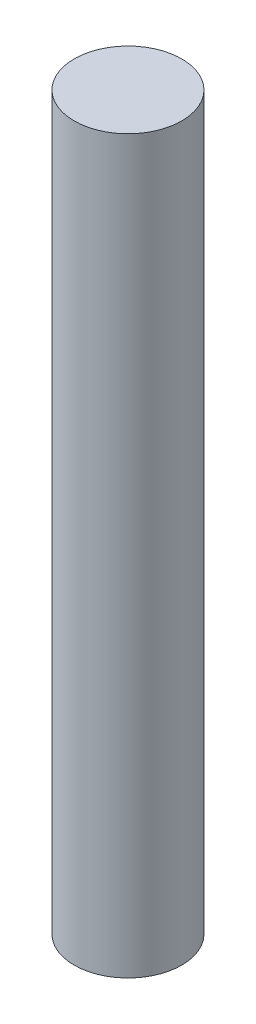
ISO-10303-21;
HEADER;
FILE_DESCRIPTION(('STEP AP214'),'2;1');
FILE_NAME('part.step','',(''),(''),'','','');
FILE_SCHEMA(('AUTOMOTIVE_DESIGN { 1 0 10303 214 1 1 1 1 }'));
ENDSEC;
DATA;
#1=APPLICATION_CONTEXT('core data for automotive mechanical design processes');
#2=APPLICATION_PROTOCOL_DEFINITION('international standard','automotive_design',2000,#1);
#3=PRODUCT_CONTEXT('',#1,'mechanical');
#4=PRODUCT('Part','Part','',(#3));
#5=PRODUCT_RELATED_PRODUCT_CATEGORY('part','',(#4));
#6=PRODUCT_DEFINITION_FORMATION('','',#4);
#7=PRODUCT_DEFINITION_CONTEXT('part definition',#1,'design');
#8=PRODUCT_DEFINITION('design','',#6,#7);
#9=PRODUCT_DEFINITION_SHAPE('','',#8);
#10=(LENGTH_UNIT() NAMED_UNIT(*) SI_UNIT(.MILLI.,.METRE.));
#11=(NAMED_UNIT(*) PLANE_ANGLE_UNIT() SI_UNIT($,.RADIAN.));
#12=(NAMED_UNIT(*) SI_UNIT($,.STERADIAN.) SOLID_ANGLE_UNIT());
#13=UNCERTAINTY_MEASURE_WITH_UNIT(LENGTH_MEASURE(1.E-05),#10,'distance_accuracy_value','');
#14=(GEOMETRIC_REPRESENTATION_CONTEXT(3) GLOBAL_UNCERTAINTY_ASSIGNED_CONTEXT((#13)) GLOBAL_UNIT_ASSIGNED_CONTEXT((#10,
#11,#12)) REPRESENTATION_CONTEXT('',''));
#15=CARTESIAN_POINT('',(0.,0.,0.));
#16=DIRECTION('',(0.,0.,1.));
#17=DIRECTION('',(1.,0.,0.));
#18=AXIS2_PLACEMENT_3D('',#15,#16,#17);
#19=CARTESIAN_POINT('',(0.,34.,0.));
#20=DIRECTION('',(0.,-1.,0.));
#21=DIRECTION('',(0.,0.,-1.));
#22=AXIS2_PLACEMENT_3D('',#19,#20,#21);
#23=CYLINDRICAL_SURFACE('',#22,2.5);
#24=CARTESIAN_POINT('',(0.,34.,0.));
#25=DIRECTION('',(0.,1.,0.));
#26=DIRECTION('',(0.,0.,1.));
#27=AXIS2_PLACEMENT_3D('',#24,#25,#26);
#28=CIRCLE('',#27,2.5);
#29=CARTESIAN_POINT('',(0.,34.,2.5));
#30=VERTEX_POINT('',#29);
#31=EDGE_CURVE('E10',#30,#30,#28,.T.);
#32=ORIENTED_EDGE('',*,*,#31,.F.);
#33=EDGE_LOOP('',(#32));
#34=FACE_BOUND('',#33,.T.);
#35=CARTESIAN_POINT('',(0.,0.,0.));
#36=DIRECTION('',(0.,1.,0.));
#37=DIRECTION('',(0.,0.,1.));
#38=AXIS2_PLACEMENT_3D('',#35,#36,#37);
#39=CIRCLE('',#38,2.5);
#40=CARTESIAN_POINT('',(0.,0.,2.5));
#41=VERTEX_POINT('',#40);
#42=EDGE_CURVE('E34',#41,#41,#39,.T.);
#43=ORIENTED_EDGE('',*,*,#42,.T.);
#44=EDGE_LOOP('',(#43));
#45=FACE_BOUND('',#44,.T.);
#46=ADVANCED_FACE('F31',(#34,#45),#23,.T.);
#47=CARTESIAN_POINT('',(0.,34.,0.));
#48=DIRECTION('',(0.,1.,0.));
#49=DIRECTION('',(0.,0.,1.));
#50=AXIS2_PLACEMENT_3D('',#47,#48,#49);
#51=PLANE('',#50);
#52=ORIENTED_EDGE('',*,*,#31,.T.);
#53=EDGE_LOOP('',(#52));
#54=FACE_BOUND('',#53,.T.);
#55=ADVANCED_FACE('F46',(#54),#51,.T.);
#56=CARTESIAN_POINT('',(0.,0.,0.));
#57=DIRECTION('',(0.,1.,0.));
#58=DIRECTION('',(0.,0.,1.));
#59=AXIS2_PLACEMENT_3D('',#56,#57,#58);
#60=PLANE('',#59);
#61=ORIENTED_EDGE('',*,*,#42,.F.);
#62=EDGE_LOOP('',(#61));
#63=FACE_BOUND('',#62,.T.);
#64=ADVANCED_FACE('F44',(#63),#60,.F.);
#65=CLOSED_SHELL('',(#46,#55,#64));
#66=MANIFOLD_SOLID_BREP('B2',#65);
#67=ADVANCED_BREP_SHAPE_REPRESENTATION('',(#18,#66),#14);
#68=SHAPE_DEFINITION_REPRESENTATION(#9,#67);
ENDSEC;
END-ISO-10303-21;
